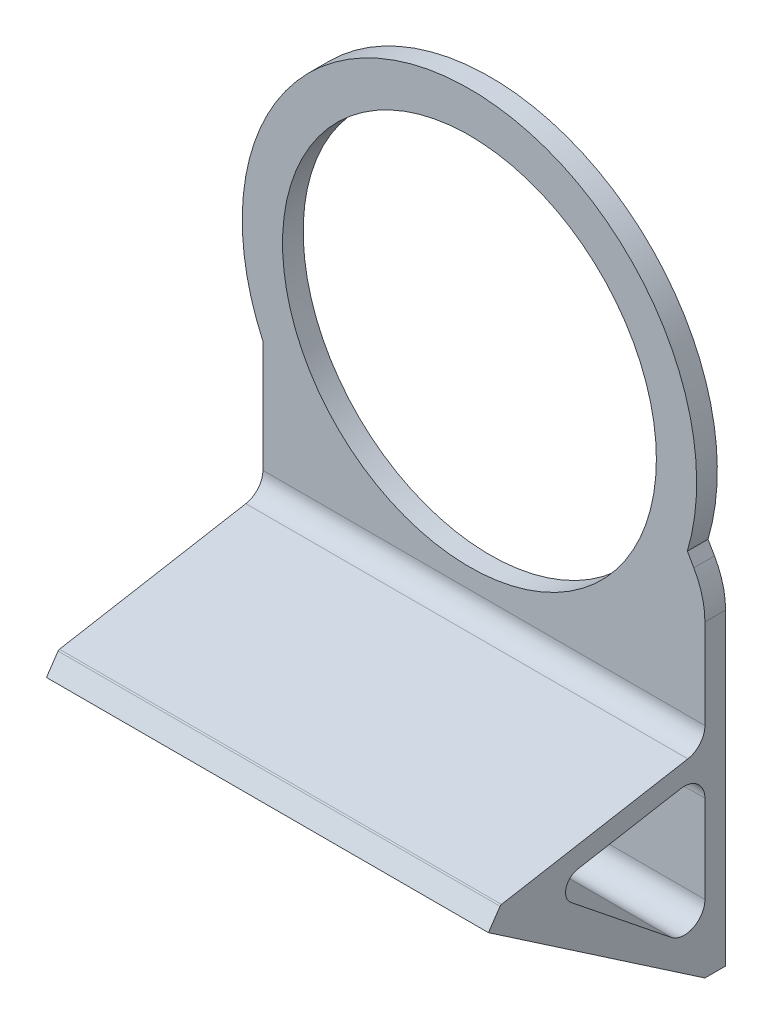
ISO-10303-21;
HEADER;
FILE_DESCRIPTION(('STEP AP214'),'2;1');
FILE_NAME('part.step','',(''),(''),'','','');
FILE_SCHEMA(('AUTOMOTIVE_DESIGN { 1 0 10303 214 1 1 1 1 }'));
ENDSEC;
DATA;
#1=APPLICATION_CONTEXT('core data for automotive mechanical design processes');
#2=APPLICATION_PROTOCOL_DEFINITION('international standard','automotive_design',2000,#1);
#3=PRODUCT_CONTEXT('',#1,'mechanical');
#4=PRODUCT('Part','Part','',(#3));
#5=PRODUCT_RELATED_PRODUCT_CATEGORY('part','',(#4));
#6=PRODUCT_DEFINITION_FORMATION('','',#4);
#7=PRODUCT_DEFINITION_CONTEXT('part definition',#1,'design');
#8=PRODUCT_DEFINITION('design','',#6,#7);
#9=PRODUCT_DEFINITION_SHAPE('','',#8);
#10=(LENGTH_UNIT() NAMED_UNIT(*) SI_UNIT(.MILLI.,.METRE.));
#11=(NAMED_UNIT(*) PLANE_ANGLE_UNIT() SI_UNIT($,.RADIAN.));
#12=(NAMED_UNIT(*) SI_UNIT($,.STERADIAN.) SOLID_ANGLE_UNIT());
#13=UNCERTAINTY_MEASURE_WITH_UNIT(LENGTH_MEASURE(1.E-05),#10,'distance_accuracy_value','');
#14=(GEOMETRIC_REPRESENTATION_CONTEXT(3) GLOBAL_UNCERTAINTY_ASSIGNED_CONTEXT((#13)) GLOBAL_UNIT_ASSIGNED_CONTEXT((#10,
#11,#12)) REPRESENTATION_CONTEXT('',''));
#15=CARTESIAN_POINT('',(0.,0.,0.));
#16=DIRECTION('',(0.,0.,1.));
#17=DIRECTION('',(1.,0.,0.));
#18=AXIS2_PLACEMENT_3D('',#15,#16,#17);
#19=CARTESIAN_POINT('',(0.,-86.4448014877958,10.));
#20=DIRECTION('',(1.,0.,0.));
#21=DIRECTION('',(0.,0.,-1.));
#22=AXIS2_PLACEMENT_3D('',#19,#20,#21);
#23=CYLINDRICAL_SURFACE('',#22,5.);
#24=DIRECTION('',(1.,0.,0.));
#25=VECTOR('',#24,1.);
#26=CARTESIAN_POINT('',(0.,-86.4448014877958,5.));
#27=LINE('',#26,#25);
#28=CARTESIAN_POINT('',(-50.,-86.4448014877958,5.));
#29=VERTEX_POINT('',#28);
#30=CARTESIAN_POINT('',(57.,-86.4448014877958,5.));
#31=VERTEX_POINT('',#30);
#32=EDGE_CURVE('E216',#29,#31,#27,.T.);
#33=ORIENTED_EDGE('',*,*,#32,.F.);
#34=CARTESIAN_POINT('',(-50.,-86.4448014877958,10.));
#35=DIRECTION('',(-1.,0.,0.));
#36=DIRECTION('',(0.,-1.,0.));
#37=AXIS2_PLACEMENT_3D('',#34,#35,#36);
#38=CIRCLE('',#37,5.);
#39=CARTESIAN_POINT('',(-50.,-90.3456904401855,13.1277892162235));
#40=VERTEX_POINT('',#39);
#41=EDGE_CURVE('E223',#29,#40,#38,.T.);
#42=ORIENTED_EDGE('',*,*,#41,.T.);
#43=DIRECTION('',(1.,0.,0.));
#44=VECTOR('',#43,1.);
#45=CARTESIAN_POINT('',(121.559312311121,-90.3456904401855,13.1277892162235));
#46=LINE('',#45,#44);
#47=CARTESIAN_POINT('',(57.,-90.3456904401855,13.1277892162235));
#48=VERTEX_POINT('',#47);
#49=EDGE_CURVE('E219',#48,#40,#46,.F.);
#50=ORIENTED_EDGE('',*,*,#49,.F.);
#51=CARTESIAN_POINT('',(57.,-86.4448014877958,10.));
#52=DIRECTION('',(1.,0.,0.));
#53=DIRECTION('',(0.,1.,0.));
#54=AXIS2_PLACEMENT_3D('',#51,#52,#53);
#55=CIRCLE('',#54,5.00000000000001);
#56=EDGE_CURVE('E383',#48,#31,#55,.T.);
#57=ORIENTED_EDGE('',*,*,#56,.T.);
#58=EDGE_LOOP('',(#33,#42,#50,#57));
#59=FACE_BOUND('',#58,.T.);
#60=ADVANCED_FACE('F41',(#59),#23,.F.);
#61=CARTESIAN_POINT('',(0.,-49.9840409313441,10.));
#62=DIRECTION('',(1.,0.,0.));
#63=DIRECTION('',(0.,0.,-1.));
#64=AXIS2_PLACEMENT_3D('',#61,#62,#63);
#65=CYLINDRICAL_SURFACE('',#64,5.);
#66=DIRECTION('',(1.,0.,0.));
#67=VECTOR('',#66,1.);
#68=CARTESIAN_POINT('',(0.,-49.9840409313441,5.));
#69=LINE('',#68,#67);
#70=CARTESIAN_POINT('',(-50.,-49.9840409313441,5.));
#71=VERTEX_POINT('',#70);
#72=CARTESIAN_POINT('',(57.,-49.9840409313441,5.));
#73=VERTEX_POINT('',#72);
#74=EDGE_CURVE('E205',#71,#73,#69,.T.);
#75=ORIENTED_EDGE('',*,*,#74,.F.);
#76=CARTESIAN_POINT('',(-50.,-49.9840409313441,10.));
#77=DIRECTION('',(-1.,0.,0.));
#78=DIRECTION('',(0.,-1.,0.));
#79=AXIS2_PLACEMENT_3D('',#76,#77,#78);
#80=CIRCLE('',#79,5.);
#81=CARTESIAN_POINT('',(-50.,-54.9080796964052,9.13175911166533));
#82=VERTEX_POINT('',#81);
#83=EDGE_CURVE('E213',#71,#82,#80,.T.);
#84=ORIENTED_EDGE('',*,*,#83,.T.);
#85=DIRECTION('',(1.,0.,0.));
#86=VECTOR('',#85,1.);
#87=CARTESIAN_POINT('',(121.559312311121,-54.9080796964052,9.13175911166533));
#88=LINE('',#87,#86);
#89=CARTESIAN_POINT('',(57.,-54.9080796964052,9.13175911166533));
#90=VERTEX_POINT('',#89);
#91=EDGE_CURVE('E209',#90,#82,#88,.F.);
#92=ORIENTED_EDGE('',*,*,#91,.F.);
#93=CARTESIAN_POINT('',(57.,-49.9840409313441,10.));
#94=DIRECTION('',(-1.,0.,0.));
#95=DIRECTION('',(0.,1.,0.));
#96=AXIS2_PLACEMENT_3D('',#93,#94,#95);
#97=CIRCLE('',#96,5.);
#98=EDGE_CURVE('E397',#73,#90,#97,.T.);
#99=ORIENTED_EDGE('',*,*,#98,.F.);
#100=EDGE_LOOP('',(#75,#84,#92,#99));
#101=FACE_BOUND('',#100,.T.);
#102=ADVANCED_FACE('F337',(#101),#65,.F.);
#103=CARTESIAN_POINT('',(0.,-65.2154401096303,10.));
#104=DIRECTION('',(-1.,0.,0.));
#105=DIRECTION('',(0.,0.,1.));
#106=AXIS2_PLACEMENT_3D('',#103,#104,#105);
#107=CYLINDRICAL_SURFACE('',#106,5.);
#108=DIRECTION('',(-1.,0.,0.));
#109=VECTOR('',#108,1.);
#110=CARTESIAN_POINT('',(0.,-65.2154401096303,5.));
#111=LINE('',#110,#109);
#112=CARTESIAN_POINT('',(57.,-65.2154401096303,5.));
#113=VERTEX_POINT('',#112);
#114=CARTESIAN_POINT('',(-50.,-65.2154401096303,5.));
#115=VERTEX_POINT('',#114);
#116=EDGE_CURVE('E188',#113,#115,#111,.T.);
#117=ORIENTED_EDGE('',*,*,#116,.F.);
#118=CARTESIAN_POINT('',(57.,-65.2154401096303,10.));
#119=DIRECTION('',(1.,0.,0.));
#120=DIRECTION('',(0.,1.,0.));
#121=AXIS2_PLACEMENT_3D('',#118,#119,#120);
#122=CIRCLE('',#121,5.);
#123=CARTESIAN_POINT('',(57.,-60.2914013445693,10.8682408883347));
#124=VERTEX_POINT('',#123);
#125=EDGE_CURVE('E367',#113,#124,#122,.T.);
#126=ORIENTED_EDGE('',*,*,#125,.T.);
#127=DIRECTION('',(-1.,0.,0.));
#128=VECTOR('',#127,1.);
#129=CARTESIAN_POINT('',(121.559312311121,-60.2914013445693,10.8682408883347));
#130=LINE('',#129,#128);
#131=CARTESIAN_POINT('',(-50.,-60.2914013445693,10.8682408883347));
#132=VERTEX_POINT('',#131);
#133=EDGE_CURVE('E198',#132,#124,#130,.F.);
#134=ORIENTED_EDGE('',*,*,#133,.F.);
#135=CARTESIAN_POINT('',(-50.,-65.2154401096303,10.));
#136=DIRECTION('',(-1.,0.,0.));
#137=DIRECTION('',(0.,-1.,0.));
#138=AXIS2_PLACEMENT_3D('',#135,#136,#137);
#139=CIRCLE('',#138,5.);
#140=EDGE_CURVE('E201',#132,#115,#139,.T.);
#141=ORIENTED_EDGE('',*,*,#140,.T.);
#142=EDGE_LOOP('',(#117,#126,#134,#141));
#143=FACE_BOUND('',#142,.T.);
#144=ADVANCED_FACE('F342',(#143),#107,.F.);
#145=CARTESIAN_POINT('',(0.,0.,5.));
#146=DIRECTION('',(0.,0.,1.));
#147=DIRECTION('',(1.,0.,0.));
#148=AXIS2_PLACEMENT_3D('',#145,#146,#147);
#149=PLANE('',#148);
#150=DIRECTION('',(0.,1.,0.));
#151=VECTOR('',#150,1.);
#152=CARTESIAN_POINT('',(-50.,-22.9128784747792,5.));
#153=LINE('',#152,#151);
#154=EDGE_CURVE('E306',#29,#115,#153,.T.);
#155=ORIENTED_EDGE('',*,*,#154,.F.);
#156=ORIENTED_EDGE('',*,*,#32,.T.);
#157=DIRECTION('',(0.,1.,0.));
#158=VECTOR('',#157,1.);
#159=CARTESIAN_POINT('',(57.,-65.2154401096303,5.));
#160=LINE('',#159,#158);
#161=EDGE_CURVE('E386',#31,#113,#160,.T.);
#162=ORIENTED_EDGE('',*,*,#161,.T.);
#163=ORIENTED_EDGE('',*,*,#116,.T.);
#164=EDGE_LOOP('',(#155,#156,#162,#163));
#165=FACE_BOUND('',#164,.T.);
#166=ADVANCED_FACE('F348',(#165),#149,.T.);
#167=DIRECTION('',(0.,-1.,0.));
#168=VECTOR('',#167,1.);
#169=CARTESIAN_POINT('',(57.,-22.9128784747792,5.));
#170=LINE('',#169,#168);
#171=CARTESIAN_POINT('',(57.,-28.2718623234016,5.));
#172=VERTEX_POINT('',#171);
#173=EDGE_CURVE('E238',#172,#73,#170,.T.);
#174=ORIENTED_EDGE('',*,*,#173,.F.);
#175=CARTESIAN_POINT('',(37.,-28.2718623234016,5.));
#176=DIRECTION('',(0.,0.,1.));
#177=DIRECTION('',(1.,0.,0.));
#178=AXIS2_PLACEMENT_3D('',#175,#176,#177);
#179=CIRCLE('',#178,20.);
#180=CARTESIAN_POINT('',(54.3205080756888,-18.2718623234017,5.));
#181=VERTEX_POINT('',#180);
#182=EDGE_CURVE('E64',#172,#181,#179,.T.);
#183=ORIENTED_EDGE('',*,*,#182,.T.);
#184=DIRECTION('',(-0.499999999999998,0.86602540378444,0.));
#185=VECTOR('',#184,1.);
#186=CARTESIAN_POINT('',(57.,-22.9128784747792,5.));
#187=LINE('',#186,#185);
#188=CARTESIAN_POINT('',(52.7536595927548,-15.5580011431978,5.));
#189=VERTEX_POINT('',#188);
#190=EDGE_CURVE('E166',#181,#189,#187,.T.);
#191=ORIENTED_EDGE('',*,*,#190,.T.);
#192=CARTESIAN_POINT('',(0.,0.,5.));
#193=DIRECTION('',(0.,0.,1.));
#194=DIRECTION('',(1.,0.,0.));
#195=AXIS2_PLACEMENT_3D('',#192,#193,#194);
#196=CIRCLE('',#195,55.);
#197=CARTESIAN_POINT('',(-50.,-22.9128784747792,5.));
#198=VERTEX_POINT('',#197);
#199=EDGE_CURVE('E173',#189,#198,#196,.T.);
#200=ORIENTED_EDGE('',*,*,#199,.T.);
#201=EDGE_CURVE('E302',#71,#198,#153,.T.);
#202=ORIENTED_EDGE('',*,*,#201,.F.);
#203=ORIENTED_EDGE('',*,*,#74,.T.);
#204=EDGE_LOOP('',(#174,#183,#191,#200,#202,#203));
#205=FACE_BOUND('',#204,.T.);
#206=CARTESIAN_POINT('',(0.,0.,5.));
#207=DIRECTION('',(0.,0.,1.));
#208=DIRECTION('',(1.,0.,0.));
#209=AXIS2_PLACEMENT_3D('',#206,#207,#208);
#210=CIRCLE('',#209,45.25);
#211=CARTESIAN_POINT('',(45.25,0.,5.));
#212=VERTEX_POINT('',#211);
#213=EDGE_CURVE('E184',#212,#212,#210,.T.);
#214=ORIENTED_EDGE('',*,*,#213,.F.);
#215=EDGE_LOOP('',(#214));
#216=FACE_BOUND('',#215,.T.);
#217=ADVANCED_FACE('F243',(#205,#216),#149,.T.);
#218=CARTESIAN_POINT('',(0.,0.,0.));
#219=DIRECTION('',(0.,0.,1.));
#220=DIRECTION('',(1.,0.,0.));
#221=AXIS2_PLACEMENT_3D('',#218,#219,#220);
#222=PLANE('',#221);
#223=DIRECTION('',(-0.499999999999998,0.86602540378444,0.));
#224=VECTOR('',#223,1.);
#225=CARTESIAN_POINT('',(57.,-22.9128784747792,0.));
#226=LINE('',#225,#224);
#227=CARTESIAN_POINT('',(54.3205080756888,-18.2718623234017,0.));
#228=VERTEX_POINT('',#227);
#229=CARTESIAN_POINT('',(52.7536595927548,-15.5580011431978,0.));
#230=VERTEX_POINT('',#229);
#231=EDGE_CURVE('E157',#228,#230,#226,.T.);
#232=ORIENTED_EDGE('',*,*,#231,.F.);
#233=CARTESIAN_POINT('',(37.,-28.2718623234016,0.));
#234=DIRECTION('',(0.,0.,1.));
#235=DIRECTION('',(1.,0.,0.));
#236=AXIS2_PLACEMENT_3D('',#233,#234,#235);
#237=CIRCLE('',#236,20.);
#238=CARTESIAN_POINT('',(57.,-28.2718623234016,0.));
#239=VERTEX_POINT('',#238);
#240=EDGE_CURVE('E11',#228,#239,#237,.F.);
#241=ORIENTED_EDGE('',*,*,#240,.T.);
#242=DIRECTION('',(0.,1.,0.));
#243=VECTOR('',#242,1.);
#244=CARTESIAN_POINT('',(57.,-102.912878474779,0.));
#245=LINE('',#244,#243);
#246=CARTESIAN_POINT('',(57.,-102.912878474779,0.));
#247=VERTEX_POINT('',#246);
#248=EDGE_CURVE('E241',#247,#239,#245,.T.);
#249=ORIENTED_EDGE('',*,*,#248,.F.);
#250=DIRECTION('',(-1.,0.,0.));
#251=VECTOR('',#250,1.);
#252=CARTESIAN_POINT('',(50.,-102.912878474779,0.));
#253=LINE('',#252,#251);
#254=CARTESIAN_POINT('',(-50.,-102.912878474779,0.));
#255=VERTEX_POINT('',#254);
#256=EDGE_CURVE('E297',#247,#255,#253,.T.);
#257=ORIENTED_EDGE('',*,*,#256,.T.);
#258=DIRECTION('',(0.,1.,0.));
#259=VECTOR('',#258,1.);
#260=CARTESIAN_POINT('',(-50.,-22.9128784747792,0.));
#261=LINE('',#260,#259);
#262=CARTESIAN_POINT('',(-50.,-22.9128784747792,0.));
#263=VERTEX_POINT('',#262);
#264=EDGE_CURVE('E182',#255,#263,#261,.T.);
#265=ORIENTED_EDGE('',*,*,#264,.T.);
#266=CARTESIAN_POINT('',(0.,0.,0.));
#267=DIRECTION('',(0.,0.,1.));
#268=DIRECTION('',(1.,0.,0.));
#269=AXIS2_PLACEMENT_3D('',#266,#267,#268);
#270=CIRCLE('',#269,55.);
#271=EDGE_CURVE('E171',#230,#263,#270,.T.);
#272=ORIENTED_EDGE('',*,*,#271,.F.);
#273=EDGE_LOOP('',(#232,#241,#249,#257,#265,#272));
#274=FACE_BOUND('',#273,.T.);
#275=CARTESIAN_POINT('',(0.,0.,0.));
#276=DIRECTION('',(0.,0.,1.));
#277=DIRECTION('',(1.,0.,0.));
#278=AXIS2_PLACEMENT_3D('',#275,#276,#277);
#279=CIRCLE('',#278,45.25);
#280=CARTESIAN_POINT('',(45.25,0.,0.));
#281=VERTEX_POINT('',#280);
#282=EDGE_CURVE('E191',#281,#281,#279,.T.);
#283=ORIENTED_EDGE('',*,*,#282,.T.);
#284=EDGE_LOOP('',(#283));
#285=FACE_BOUND('',#284,.T.);
#286=ADVANCED_FACE('F178',(#274,#285),#222,.F.);
#287=CARTESIAN_POINT('',(0.,0.,5.));
#288=DIRECTION('',(0.,0.,-1.));
#289=DIRECTION('',(-1.,0.,0.));
#290=AXIS2_PLACEMENT_3D('',#287,#288,#289);
#291=CYLINDRICAL_SURFACE('',#290,55.);
#292=ORIENTED_EDGE('',*,*,#199,.F.);
#293=DIRECTION('',(0.,0.,1.));
#294=VECTOR('',#293,1.);
#295=CARTESIAN_POINT('',(52.7536595927548,-15.5580011431978,0.));
#296=LINE('',#295,#294);
#297=EDGE_CURVE('E160',#230,#189,#296,.T.);
#298=ORIENTED_EDGE('',*,*,#297,.F.);
#299=ORIENTED_EDGE('',*,*,#271,.T.);
#300=DIRECTION('',(0.,0.,-1.));
#301=VECTOR('',#300,1.);
#302=CARTESIAN_POINT('',(-50.,-22.9128784747792,5.));
#303=LINE('',#302,#301);
#304=EDGE_CURVE('E311',#198,#263,#303,.T.);
#305=ORIENTED_EDGE('',*,*,#304,.F.);
#306=EDGE_LOOP('',(#292,#298,#299,#305));
#307=FACE_BOUND('',#306,.T.);
#308=ADVANCED_FACE('F169',(#307),#291,.T.);
#309=CARTESIAN_POINT('',(0.,0.,5.));
#310=DIRECTION('',(0.,0.,-1.));
#311=DIRECTION('',(-1.,0.,0.));
#312=AXIS2_PLACEMENT_3D('',#309,#310,#311);
#313=CYLINDRICAL_SURFACE('',#312,45.25);
#314=ORIENTED_EDGE('',*,*,#213,.T.);
#315=EDGE_LOOP('',(#314));
#316=FACE_BOUND('',#315,.T.);
#317=ORIENTED_EDGE('',*,*,#282,.F.);
#318=EDGE_LOOP('',(#317));
#319=FACE_BOUND('',#318,.T.);
#320=ADVANCED_FACE('F320',(#316,#319),#313,.F.);
#321=CARTESIAN_POINT('',(-50.,-22.9128784747792,5.));
#322=DIRECTION('',(-1.,0.,0.));
#323=DIRECTION('',(0.,-1.,0.));
#324=AXIS2_PLACEMENT_3D('',#321,#322,#323);
#325=PLANE('',#324);
#326=ORIENTED_EDGE('',*,*,#41,.F.);
#327=ORIENTED_EDGE('',*,*,#154,.T.);
#328=ORIENTED_EDGE('',*,*,#140,.F.);
#329=DIRECTION('',(0.,0.173648177666934,-0.984807753012208));
#330=VECTOR('',#329,1.);
#331=CARTESIAN_POINT('',(-50.,-64.6935954811828,35.8343244617383));
#332=LINE('',#331,#330);
#333=CARTESIAN_POINT('',(-50.,-64.6935954811828,35.8343244617383));
#334=VERTEX_POINT('',#333);
#335=EDGE_CURVE('E274',#334,#132,#332,.T.);
#336=ORIENTED_EDGE('',*,*,#335,.F.);
#337=CARTESIAN_POINT('',(-50.,-68.1404226167256,35.226555839904));
#338=DIRECTION('',(-1.,0.,0.));
#339=DIRECTION('',(0.,-1.,0.));
#340=AXIS2_PLACEMENT_3D('',#337,#338,#339);
#341=CIRCLE('',#340,3.50000000000001);
#342=CARTESIAN_POINT('',(-50.,-70.8710448833983,37.4160082912605));
#343=VERTEX_POINT('',#342);
#344=EDGE_CURVE('E253',#343,#334,#341,.T.);
#345=ORIENTED_EDGE('',*,*,#344,.F.);
#346=DIRECTION('',(0.,0.625557843244707,0.780177790477933));
#347=VECTOR('',#346,1.);
#348=CARTESIAN_POINT('',(-50.,-70.8710448833984,37.4160082912605));
#349=LINE('',#348,#347);
#350=EDGE_CURVE('E249',#40,#343,#349,.T.);
#351=ORIENTED_EDGE('',*,*,#350,.F.);
#352=EDGE_LOOP('',(#326,#327,#328,#336,#345,#351));
#353=FACE_BOUND('',#352,.T.);
#354=ORIENTED_EDGE('',*,*,#83,.F.);
#355=ORIENTED_EDGE('',*,*,#201,.T.);
#356=ORIENTED_EDGE('',*,*,#304,.T.);
#357=ORIENTED_EDGE('',*,*,#264,.F.);
#358=DIRECTION('',(0.,0.,-1.));
#359=VECTOR('',#358,1.);
#360=CARTESIAN_POINT('',(-50.,-102.912878474779,5.));
#361=LINE('',#360,#359);
#362=CARTESIAN_POINT('',(-50.,-102.912878474779,5.));
#363=VERTEX_POINT('',#362);
#364=EDGE_CURVE('E314',#363,#255,#361,.T.);
#365=ORIENTED_EDGE('',*,*,#364,.F.);
#366=DIRECTION('',(0.,-0.563057488623762,-0.826417730028043));
#367=VECTOR('',#366,1.);
#368=CARTESIAN_POINT('',(-50.,-102.912878474779,4.99999999999999));
#369=LINE('',#368,#367);
#370=CARTESIAN_POINT('',(-50.,-67.2113087929432,57.4003512448013));
#371=VERTEX_POINT('',#370);
#372=EDGE_CURVE('E259',#371,#363,#369,.T.);
#373=ORIENTED_EDGE('',*,*,#372,.F.);
#374=DIRECTION('',(0.,-0.826417730028043,0.563057488623761));
#375=VECTOR('',#374,1.);
#376=CARTESIAN_POINT('',(-50.,-67.2113087929432,57.4003512448013));
#377=LINE('',#376,#375);
#378=CARTESIAN_POINT('',(-50.,-63.079220142803,54.5850638016825));
#379=VERTEX_POINT('',#378);
#380=EDGE_CURVE('E263',#379,#371,#377,.T.);
#381=ORIENTED_EDGE('',*,*,#380,.F.);
#382=CARTESIAN_POINT('',(-50.,-63.3665727790829,54.1633070216201));
#383=DIRECTION('',(-1.,0.,0.));
#384=DIRECTION('',(0.,-1.,0.));
#385=AXIS2_PLACEMENT_3D('',#382,#383,#384);
#386=CIRCLE('',#385,0.510343334536243);
#387=CARTESIAN_POINT('',(-50.,-62.8639827065335,54.2519272116468));
#388=VERTEX_POINT('',#387);
#389=EDGE_CURVE('E267',#388,#379,#386,.F.);
#390=ORIENTED_EDGE('',*,*,#389,.F.);
#391=DIRECTION('',(0.,-0.173648177666934,0.984807753012207));
#392=VECTOR('',#391,1.);
#393=CARTESIAN_POINT('',(-50.,-62.8639827065335,54.2519272116468));
#394=LINE('',#393,#392);
#395=EDGE_CURVE('E271',#82,#388,#394,.T.);
#396=ORIENTED_EDGE('',*,*,#395,.F.);
#397=EDGE_LOOP('',(#354,#355,#356,#357,#365,#373,#381,#390,#396));
#398=FACE_BOUND('',#397,.T.);
#399=ADVANCED_FACE('F322',(#353,#398),#325,.T.);
#400=CARTESIAN_POINT('',(50.,-102.912878474779,5.));
#401=DIRECTION('',(0.,-1.,0.));
#402=DIRECTION('',(1.,0.,0.));
#403=AXIS2_PLACEMENT_3D('',#400,#401,#402);
#404=PLANE('',#403);
#405=ORIENTED_EDGE('',*,*,#256,.F.);
#406=DIRECTION('',(0.,0.,-1.));
#407=VECTOR('',#406,1.);
#408=CARTESIAN_POINT('',(57.,-102.912878474779,5.));
#409=LINE('',#408,#407);
#410=CARTESIAN_POINT('',(57.,-102.912878474779,5.));
#411=VERTEX_POINT('',#410);
#412=EDGE_CURVE('E255',#411,#247,#409,.T.);
#413=ORIENTED_EDGE('',*,*,#412,.F.);
#414=DIRECTION('',(-1.,0.,0.));
#415=VECTOR('',#414,1.);
#416=CARTESIAN_POINT('',(50.,-102.912878474779,5.));
#417=LINE('',#416,#415);
#418=EDGE_CURVE('E298',#411,#363,#417,.T.);
#419=ORIENTED_EDGE('',*,*,#418,.T.);
#420=ORIENTED_EDGE('',*,*,#364,.T.);
#421=EDGE_LOOP('',(#405,#413,#419,#420));
#422=FACE_BOUND('',#421,.T.);
#423=ADVANCED_FACE('F329',(#422),#404,.T.);
#424=CARTESIAN_POINT('',(121.559312311121,-70.8710448833984,37.4160082912605));
#425=DIRECTION('',(0.,-0.780177790477933,0.625557843244707));
#426=DIRECTION('',(0.,-0.625557843244707,-0.780177790477933));
#427=AXIS2_PLACEMENT_3D('',#424,#425,#426);
#428=PLANE('',#427);
#429=DIRECTION('',(-1.,0.,0.));
#430=VECTOR('',#429,1.);
#431=CARTESIAN_POINT('',(121.559312311121,-70.8710448833983,37.4160082912605));
#432=LINE('',#431,#430);
#433=CARTESIAN_POINT('',(57.,-70.8710448833983,37.4160082912605));
#434=VERTEX_POINT('',#433);
#435=EDGE_CURVE('E262',#434,#343,#432,.T.);
#436=ORIENTED_EDGE('',*,*,#435,.F.);
#437=DIRECTION('',(0.,-0.625557843244708,-0.780177790477933));
#438=VECTOR('',#437,1.);
#439=CARTESIAN_POINT('',(57.,-90.3456904401855,13.1277892162235));
#440=LINE('',#439,#438);
#441=EDGE_CURVE('E381',#434,#48,#440,.T.);
#442=ORIENTED_EDGE('',*,*,#441,.T.);
#443=ORIENTED_EDGE('',*,*,#49,.T.);
#444=ORIENTED_EDGE('',*,*,#350,.T.);
#445=EDGE_LOOP('',(#436,#442,#443,#444));
#446=FACE_BOUND('',#445,.T.);
#447=ADVANCED_FACE('F380',(#446),#428,.F.);
#448=CARTESIAN_POINT('',(121.559312311121,-68.1404226167256,35.226555839904));
#449=DIRECTION('',(-1.,0.,0.));
#450=DIRECTION('',(0.,0.,1.));
#451=AXIS2_PLACEMENT_3D('',#448,#449,#450);
#452=CYLINDRICAL_SURFACE('',#451,3.50000000000001);
#453=DIRECTION('',(-1.,0.,0.));
#454=VECTOR('',#453,1.);
#455=CARTESIAN_POINT('',(121.559312311121,-64.6935954811828,35.8343244617383));
#456=LINE('',#455,#454);
#457=CARTESIAN_POINT('',(57.,-64.6935954811828,35.8343244617383));
#458=VERTEX_POINT('',#457);
#459=EDGE_CURVE('E284',#458,#334,#456,.T.);
#460=ORIENTED_EDGE('',*,*,#459,.F.);
#461=CARTESIAN_POINT('',(57.,-68.1404226167256,35.226555839904));
#462=DIRECTION('',(1.,0.,0.));
#463=DIRECTION('',(0.,1.,0.));
#464=AXIS2_PLACEMENT_3D('',#461,#462,#463);
#465=CIRCLE('',#464,3.50000000000001);
#466=EDGE_CURVE('E175',#458,#434,#465,.T.);
#467=ORIENTED_EDGE('',*,*,#466,.T.);
#468=ORIENTED_EDGE('',*,*,#435,.T.);
#469=ORIENTED_EDGE('',*,*,#344,.T.);
#470=EDGE_LOOP('',(#460,#467,#468,#469));
#471=FACE_BOUND('',#470,.T.);
#472=ADVANCED_FACE('F374',(#471),#452,.F.);
#473=CARTESIAN_POINT('',(121.559312311121,-64.6935954811828,35.8343244617383));
#474=DIRECTION('',(0.,0.984807753012208,0.173648177666934));
#475=DIRECTION('',(0.,-0.173648177666934,0.984807753012208));
#476=AXIS2_PLACEMENT_3D('',#473,#474,#475);
#477=PLANE('',#476);
#478=ORIENTED_EDGE('',*,*,#335,.T.);
#479=ORIENTED_EDGE('',*,*,#133,.T.);
#480=DIRECTION('',(0.,-0.173648177666934,0.984807753012207));
#481=VECTOR('',#480,1.);
#482=CARTESIAN_POINT('',(57.,-64.6935954811828,35.8343244617383));
#483=LINE('',#482,#481);
#484=EDGE_CURVE('E391',#124,#458,#483,.T.);
#485=ORIENTED_EDGE('',*,*,#484,.T.);
#486=ORIENTED_EDGE('',*,*,#459,.T.);
#487=EDGE_LOOP('',(#478,#479,#485,#486));
#488=FACE_BOUND('',#487,.T.);
#489=ADVANCED_FACE('F371',(#488),#477,.F.);
#490=CARTESIAN_POINT('',(121.559312311121,-62.8639827065335,54.2519272116468));
#491=DIRECTION('',(0.,-0.984807753012207,-0.173648177666934));
#492=DIRECTION('',(0.,0.173648177666934,-0.984807753012207));
#493=AXIS2_PLACEMENT_3D('',#490,#491,#492);
#494=PLANE('',#493);
#495=DIRECTION('',(-1.,0.,0.));
#496=VECTOR('',#495,1.);
#497=CARTESIAN_POINT('',(121.559312311121,-62.8639827065335,54.2519272116468));
#498=LINE('',#497,#496);
#499=CARTESIAN_POINT('',(57.,-62.8639827065335,54.2519272116468));
#500=VERTEX_POINT('',#499);
#501=EDGE_CURVE('E287',#500,#388,#498,.T.);
#502=ORIENTED_EDGE('',*,*,#501,.F.);
#503=DIRECTION('',(0.,-0.173648177666934,0.984807753012208));
#504=VECTOR('',#503,1.);
#505=CARTESIAN_POINT('',(57.,-54.9080796964052,9.13175911166533));
#506=LINE('',#505,#504);
#507=EDGE_CURVE('E400',#90,#500,#506,.T.);
#508=ORIENTED_EDGE('',*,*,#507,.F.);
#509=ORIENTED_EDGE('',*,*,#91,.T.);
#510=ORIENTED_EDGE('',*,*,#395,.T.);
#511=EDGE_LOOP('',(#502,#508,#509,#510));
#512=FACE_BOUND('',#511,.T.);
#513=ADVANCED_FACE('F440',(#512),#494,.F.);
#514=CARTESIAN_POINT('',(121.559312311121,-63.3665727790829,54.1633070216201));
#515=DIRECTION('',(-1.,0.,0.));
#516=DIRECTION('',(0.,0.,1.));
#517=AXIS2_PLACEMENT_3D('',#514,#515,#516);
#518=CYLINDRICAL_SURFACE('',#517,0.510343334536243);
#519=DIRECTION('',(-1.,0.,0.));
#520=VECTOR('',#519,1.);
#521=CARTESIAN_POINT('',(121.559312311121,-63.079220142803,54.5850638016825));
#522=LINE('',#521,#520);
#523=CARTESIAN_POINT('',(57.,-63.079220142803,54.5850638016825));
#524=VERTEX_POINT('',#523);
#525=EDGE_CURVE('E291',#524,#379,#522,.T.);
#526=ORIENTED_EDGE('',*,*,#525,.F.);
#527=CARTESIAN_POINT('',(57.,-63.3665727790829,54.1633070216201));
#528=DIRECTION('',(1.,0.,0.));
#529=DIRECTION('',(0.,1.,0.));
#530=AXIS2_PLACEMENT_3D('',#527,#528,#529);
#531=CIRCLE('',#530,0.51034333453625);
#532=EDGE_CURVE('E404',#500,#524,#531,.T.);
#533=ORIENTED_EDGE('',*,*,#532,.F.);
#534=ORIENTED_EDGE('',*,*,#501,.T.);
#535=ORIENTED_EDGE('',*,*,#389,.T.);
#536=EDGE_LOOP('',(#526,#533,#534,#535));
#537=FACE_BOUND('',#536,.T.);
#538=ADVANCED_FACE('F436',(#537),#518,.T.);
#539=CARTESIAN_POINT('',(121.559312311121,-67.2113087929432,57.4003512448013));
#540=DIRECTION('',(0.,-0.563057488623761,-0.826417730028043));
#541=DIRECTION('',(0.,0.826417730028043,-0.563057488623761));
#542=AXIS2_PLACEMENT_3D('',#539,#540,#541);
#543=PLANE('',#542);
#544=DIRECTION('',(-1.,0.,0.));
#545=VECTOR('',#544,1.);
#546=CARTESIAN_POINT('',(121.559312311121,-67.2113087929432,57.4003512448013));
#547=LINE('',#546,#545);
#548=CARTESIAN_POINT('',(57.,-67.2113087929432,57.4003512448013));
#549=VERTEX_POINT('',#548);
#550=EDGE_CURVE('E294',#549,#371,#547,.T.);
#551=ORIENTED_EDGE('',*,*,#550,.F.);
#552=DIRECTION('',(0.,-0.826417730028044,0.563057488623759));
#553=VECTOR('',#552,1.);
#554=CARTESIAN_POINT('',(57.,-63.079220142803,54.5850638016825));
#555=LINE('',#554,#553);
#556=EDGE_CURVE('E408',#524,#549,#555,.T.);
#557=ORIENTED_EDGE('',*,*,#556,.F.);
#558=ORIENTED_EDGE('',*,*,#525,.T.);
#559=ORIENTED_EDGE('',*,*,#380,.T.);
#560=EDGE_LOOP('',(#551,#557,#558,#559));
#561=FACE_BOUND('',#560,.T.);
#562=ADVANCED_FACE('F432',(#561),#543,.F.);
#563=CARTESIAN_POINT('',(121.559312311121,-102.912878474779,5.));
#564=DIRECTION('',(0.,0.826417730028043,-0.563057488623762));
#565=DIRECTION('',(0.,0.563057488623762,0.826417730028043));
#566=AXIS2_PLACEMENT_3D('',#563,#564,#565);
#567=PLANE('',#566);
#568=ORIENTED_EDGE('',*,*,#418,.F.);
#569=DIRECTION('',(0.,-0.563057488623762,-0.826417730028042));
#570=VECTOR('',#569,1.);
#571=CARTESIAN_POINT('',(57.,-67.2113087929432,57.4003512448013));
#572=LINE('',#571,#570);
#573=EDGE_CURVE('E412',#549,#411,#572,.T.);
#574=ORIENTED_EDGE('',*,*,#573,.F.);
#575=ORIENTED_EDGE('',*,*,#550,.T.);
#576=ORIENTED_EDGE('',*,*,#372,.T.);
#577=EDGE_LOOP('',(#568,#574,#575,#576));
#578=FACE_BOUND('',#577,.T.);
#579=ADVANCED_FACE('F427',(#578),#567,.F.);
#580=CARTESIAN_POINT('',(57.,-49.9840409313441,10.));
#581=DIRECTION('',(1.,0.,0.));
#582=DIRECTION('',(0.,1.,0.));
#583=AXIS2_PLACEMENT_3D('',#580,#581,#582);
#584=PLANE('',#583);
#585=ORIENTED_EDGE('',*,*,#248,.T.);
#586=DIRECTION('',(0.,0.,1.));
#587=VECTOR('',#586,1.);
#588=CARTESIAN_POINT('',(57.,-28.2718623234016,10.));
#589=LINE('',#588,#587);
#590=EDGE_CURVE('E226',#239,#172,#589,.T.);
#591=ORIENTED_EDGE('',*,*,#590,.T.);
#592=ORIENTED_EDGE('',*,*,#173,.T.);
#593=ORIENTED_EDGE('',*,*,#98,.T.);
#594=ORIENTED_EDGE('',*,*,#507,.T.);
#595=ORIENTED_EDGE('',*,*,#532,.T.);
#596=ORIENTED_EDGE('',*,*,#556,.T.);
#597=ORIENTED_EDGE('',*,*,#573,.T.);
#598=ORIENTED_EDGE('',*,*,#412,.T.);
#599=EDGE_LOOP('',(#585,#591,#592,#593,#594,#595,#596,#597,#598));
#600=FACE_BOUND('',#599,.T.);
#601=ORIENTED_EDGE('',*,*,#441,.F.);
#602=ORIENTED_EDGE('',*,*,#466,.F.);
#603=ORIENTED_EDGE('',*,*,#484,.F.);
#604=ORIENTED_EDGE('',*,*,#125,.F.);
#605=ORIENTED_EDGE('',*,*,#161,.F.);
#606=ORIENTED_EDGE('',*,*,#56,.F.);
#607=EDGE_LOOP('',(#601,#602,#603,#604,#605,#606));
#608=FACE_BOUND('',#607,.T.);
#609=ADVANCED_FACE('F235',(#600,#608),#584,.T.);
#610=CARTESIAN_POINT('',(57.,-22.9128784747792,0.));
#611=DIRECTION('',(0.86602540378444,0.499999999999998,0.));
#612=DIRECTION('',(-0.499999999999998,0.86602540378444,0.));
#613=AXIS2_PLACEMENT_3D('',#610,#611,#612);
#614=PLANE('',#613);
#615=ORIENTED_EDGE('',*,*,#190,.F.);
#616=DIRECTION('',(0.,0.,1.));
#617=VECTOR('',#616,1.);
#618=CARTESIAN_POINT('',(54.3205080756888,-18.2718623234017,0.));
#619=LINE('',#618,#617);
#620=EDGE_CURVE('E50',#181,#228,#619,.F.);
#621=ORIENTED_EDGE('',*,*,#620,.T.);
#622=ORIENTED_EDGE('',*,*,#231,.T.);
#623=ORIENTED_EDGE('',*,*,#297,.T.);
#624=EDGE_LOOP('',(#615,#621,#622,#623));
#625=FACE_BOUND('',#624,.T.);
#626=ADVANCED_FACE('F159',(#625),#614,.T.);
#627=CARTESIAN_POINT('',(37.,-28.2718623234016,10.));
#628=DIRECTION('',(0.,0.,1.));
#629=DIRECTION('',(1.,0.,0.));
#630=AXIS2_PLACEMENT_3D('',#627,#628,#629);
#631=CYLINDRICAL_SURFACE('',#630,20.);
#632=ORIENTED_EDGE('',*,*,#240,.F.);
#633=ORIENTED_EDGE('',*,*,#620,.F.);
#634=ORIENTED_EDGE('',*,*,#182,.F.);
#635=ORIENTED_EDGE('',*,*,#590,.F.);
#636=EDGE_LOOP('',(#632,#633,#634,#635));
#637=FACE_BOUND('',#636,.T.);
#638=ADVANCED_FACE('F43',(#637),#631,.T.);
#639=CLOSED_SHELL('',(#60,#102,#144,#166,#217,#286,#308,#320,#399,#423,#447,#472,#489,#513,#538,
#562,#579,#609,#626,#638));
#640=MANIFOLD_SOLID_BREP('B2',#639);
#641=ADVANCED_BREP_SHAPE_REPRESENTATION('',(#18,#640),#14);
#642=SHAPE_DEFINITION_REPRESENTATION(#9,#641);
ENDSEC;
END-ISO-10303-21;
